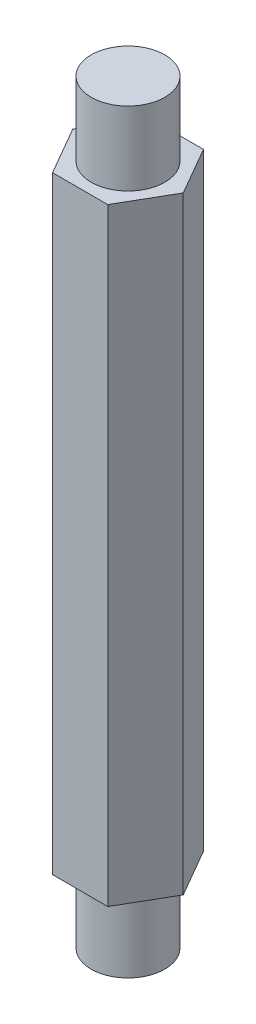
ISO-10303-21;
HEADER;
FILE_DESCRIPTION(('STEP AP214'),'2;1');
FILE_NAME('part.step','',(''),(''),'','','');
FILE_SCHEMA(('AUTOMOTIVE_DESIGN { 1 0 10303 214 1 1 1 1 }'));
ENDSEC;
DATA;
#1=APPLICATION_CONTEXT('core data for automotive mechanical design processes');
#2=APPLICATION_PROTOCOL_DEFINITION('international standard','automotive_design',2000,#1);
#3=PRODUCT_CONTEXT('',#1,'mechanical');
#4=PRODUCT('Part','Part','',(#3));
#5=PRODUCT_RELATED_PRODUCT_CATEGORY('part','',(#4));
#6=PRODUCT_DEFINITION_FORMATION('','',#4);
#7=PRODUCT_DEFINITION_CONTEXT('part definition',#1,'design');
#8=PRODUCT_DEFINITION('design','',#6,#7);
#9=PRODUCT_DEFINITION_SHAPE('','',#8);
#10=(LENGTH_UNIT() NAMED_UNIT(*) SI_UNIT(.MILLI.,.METRE.));
#11=(NAMED_UNIT(*) PLANE_ANGLE_UNIT() SI_UNIT($,.RADIAN.));
#12=(NAMED_UNIT(*) SI_UNIT($,.STERADIAN.) SOLID_ANGLE_UNIT());
#13=UNCERTAINTY_MEASURE_WITH_UNIT(LENGTH_MEASURE(1.E-05),#10,'distance_accuracy_value','');
#14=(GEOMETRIC_REPRESENTATION_CONTEXT(3) GLOBAL_UNCERTAINTY_ASSIGNED_CONTEXT((#13)) GLOBAL_UNIT_ASSIGNED_CONTEXT((#10,
#11,#12)) REPRESENTATION_CONTEXT('',''));
#15=CARTESIAN_POINT('',(0.,0.,0.));
#16=DIRECTION('',(0.,0.,1.));
#17=DIRECTION('',(1.,0.,0.));
#18=AXIS2_PLACEMENT_3D('',#15,#16,#17);
#19=CARTESIAN_POINT('',(0.,2.,0.));
#20=DIRECTION('',(0.,-1.,0.));
#21=DIRECTION('',(0.,0.,-1.));
#22=AXIS2_PLACEMENT_3D('',#19,#20,#21);
#23=CYLINDRICAL_SURFACE('',#22,1.);
#24=CARTESIAN_POINT('',(0.,2.,0.));
#25=DIRECTION('',(0.,1.,0.));
#26=DIRECTION('',(0.,0.,1.));
#27=AXIS2_PLACEMENT_3D('',#24,#25,#26);
#28=CIRCLE('',#27,1.);
#29=CARTESIAN_POINT('',(0.,2.,1.));
#30=VERTEX_POINT('',#29);
#31=EDGE_CURVE('E11',#30,#30,#28,.T.);
#32=ORIENTED_EDGE('',*,*,#31,.F.);
#33=EDGE_LOOP('',(#32));
#34=FACE_BOUND('',#33,.T.);
#35=CARTESIAN_POINT('',(0.,0.,0.));
#36=DIRECTION('',(0.,1.,0.));
#37=DIRECTION('',(0.,0.,1.));
#38=AXIS2_PLACEMENT_3D('',#35,#36,#37);
#39=CIRCLE('',#38,1.);
#40=CARTESIAN_POINT('',(0.,0.,1.));
#41=VERTEX_POINT('',#40);
#42=EDGE_CURVE('E37',#41,#41,#39,.T.);
#43=ORIENTED_EDGE('',*,*,#42,.T.);
#44=EDGE_LOOP('',(#43));
#45=FACE_BOUND('',#44,.T.);
#46=ADVANCED_FACE('F34',(#34,#45),#23,.T.);
#47=CARTESIAN_POINT('',(0.,0.,0.));
#48=DIRECTION('',(0.,1.,0.));
#49=DIRECTION('',(0.,0.,1.));
#50=AXIS2_PLACEMENT_3D('',#47,#48,#49);
#51=PLANE('',#50);
#52=ORIENTED_EDGE('',*,*,#42,.F.);
#53=EDGE_LOOP('',(#52));
#54=FACE_BOUND('',#53,.T.);
#55=ADVANCED_FACE('F143',(#54),#51,.F.);
#56=CARTESIAN_POINT('',(0.750555349946514,18.52,1.3));
#57=DIRECTION('',(-0.866025403784439,0.,-0.5));
#58=DIRECTION('',(-0.5,0.,0.866025403784439));
#59=AXIS2_PLACEMENT_3D('',#56,#57,#58);
#60=PLANE('',#59);
#61=DIRECTION('',(0.5,0.,-0.866025403784439));
#62=VECTOR('',#61,1.);
#63=CARTESIAN_POINT('',(0.750555349946514,2.,1.3));
#64=LINE('',#63,#62);
#65=CARTESIAN_POINT('',(0.750555349946514,2.,1.3));
#66=VERTEX_POINT('',#65);
#67=CARTESIAN_POINT('',(1.50111069989303,2.,0.));
#68=VERTEX_POINT('',#67);
#69=EDGE_CURVE('E119',#66,#68,#64,.T.);
#70=ORIENTED_EDGE('',*,*,#69,.T.);
#71=DIRECTION('',(0.,-1.,0.));
#72=VECTOR('',#71,1.);
#73=CARTESIAN_POINT('',(1.50111069989303,18.52,0.));
#74=LINE('',#73,#72);
#75=CARTESIAN_POINT('',(1.50111069989303,18.52,0.));
#76=VERTEX_POINT('',#75);
#77=EDGE_CURVE('E137',#76,#68,#74,.T.);
#78=ORIENTED_EDGE('',*,*,#77,.F.);
#79=DIRECTION('',(0.5,0.,-0.866025403784439));
#80=VECTOR('',#79,1.);
#81=CARTESIAN_POINT('',(0.750555349946514,18.52,1.3));
#82=LINE('',#81,#80);
#83=CARTESIAN_POINT('',(0.750555349946514,18.52,1.3));
#84=VERTEX_POINT('',#83);
#85=EDGE_CURVE('E130',#84,#76,#82,.T.);
#86=ORIENTED_EDGE('',*,*,#85,.F.);
#87=DIRECTION('',(0.,-1.,0.));
#88=VECTOR('',#87,1.);
#89=CARTESIAN_POINT('',(0.750555349946514,18.52,1.3));
#90=LINE('',#89,#88);
#91=EDGE_CURVE('E115',#84,#66,#90,.T.);
#92=ORIENTED_EDGE('',*,*,#91,.T.);
#93=EDGE_LOOP('',(#70,#78,#86,#92));
#94=FACE_BOUND('',#93,.T.);
#95=ADVANCED_FACE('F145',(#94),#60,.F.);
#96=CARTESIAN_POINT('',(1.50111069989303,18.52,0.));
#97=DIRECTION('',(-0.866025403784439,0.,0.5));
#98=DIRECTION('',(0.5,0.,0.866025403784439));
#99=AXIS2_PLACEMENT_3D('',#96,#97,#98);
#100=PLANE('',#99);
#101=DIRECTION('',(-0.5,0.,-0.866025403784439));
#102=VECTOR('',#101,1.);
#103=CARTESIAN_POINT('',(1.50111069989303,2.,0.));
#104=LINE('',#103,#102);
#105=CARTESIAN_POINT('',(0.750555349946513,2.,-1.3));
#106=VERTEX_POINT('',#105);
#107=EDGE_CURVE('E122',#68,#106,#104,.T.);
#108=ORIENTED_EDGE('',*,*,#107,.T.);
#109=DIRECTION('',(0.,-1.,0.));
#110=VECTOR('',#109,1.);
#111=CARTESIAN_POINT('',(0.750555349946513,18.52,-1.3));
#112=LINE('',#111,#110);
#113=CARTESIAN_POINT('',(0.750555349946513,18.52,-1.3));
#114=VERTEX_POINT('',#113);
#115=EDGE_CURVE('E134',#114,#106,#112,.T.);
#116=ORIENTED_EDGE('',*,*,#115,.F.);
#117=DIRECTION('',(-0.5,0.,-0.866025403784439));
#118=VECTOR('',#117,1.);
#119=CARTESIAN_POINT('',(1.50111069989303,18.52,0.));
#120=LINE('',#119,#118);
#121=EDGE_CURVE('E88',#76,#114,#120,.T.);
#122=ORIENTED_EDGE('',*,*,#121,.F.);
#123=ORIENTED_EDGE('',*,*,#77,.T.);
#124=EDGE_LOOP('',(#108,#116,#122,#123));
#125=FACE_BOUND('',#124,.T.);
#126=ADVANCED_FACE('F150',(#125),#100,.F.);
#127=CARTESIAN_POINT('',(0.750555349946513,18.52,-1.3));
#128=DIRECTION('',(0.,0.,1.));
#129=DIRECTION('',(1.,0.,0.));
#130=AXIS2_PLACEMENT_3D('',#127,#128,#129);
#131=PLANE('',#130);
#132=DIRECTION('',(-1.,0.,0.));
#133=VECTOR('',#132,1.);
#134=CARTESIAN_POINT('',(0.750555349946513,2.,-1.3));
#135=LINE('',#134,#133);
#136=CARTESIAN_POINT('',(-0.750555349946514,2.,-1.3));
#137=VERTEX_POINT('',#136);
#138=EDGE_CURVE('E125',#106,#137,#135,.T.);
#139=ORIENTED_EDGE('',*,*,#138,.T.);
#140=DIRECTION('',(0.,-1.,0.));
#141=VECTOR('',#140,1.);
#142=CARTESIAN_POINT('',(-0.750555349946514,18.52,-1.3));
#143=LINE('',#142,#141);
#144=CARTESIAN_POINT('',(-0.750555349946514,18.52,-1.3));
#145=VERTEX_POINT('',#144);
#146=EDGE_CURVE('E110',#145,#137,#143,.T.);
#147=ORIENTED_EDGE('',*,*,#146,.F.);
#148=DIRECTION('',(-1.,0.,0.));
#149=VECTOR('',#148,1.);
#150=CARTESIAN_POINT('',(0.750555349946513,18.52,-1.3));
#151=LINE('',#150,#149);
#152=EDGE_CURVE('E101',#114,#145,#151,.T.);
#153=ORIENTED_EDGE('',*,*,#152,.F.);
#154=ORIENTED_EDGE('',*,*,#115,.T.);
#155=EDGE_LOOP('',(#139,#147,#153,#154));
#156=FACE_BOUND('',#155,.T.);
#157=ADVANCED_FACE('F157',(#156),#131,.F.);
#158=CARTESIAN_POINT('',(-0.750555349946514,18.52,-1.3));
#159=DIRECTION('',(0.866025403784439,0.,0.5));
#160=DIRECTION('',(0.5,0.,-0.866025403784439));
#161=AXIS2_PLACEMENT_3D('',#158,#159,#160);
#162=PLANE('',#161);
#163=DIRECTION('',(-0.5,0.,0.866025403784439));
#164=VECTOR('',#163,1.);
#165=CARTESIAN_POINT('',(-0.750555349946514,2.,-1.3));
#166=LINE('',#165,#164);
#167=CARTESIAN_POINT('',(-1.50111069989303,2.,0.));
#168=VERTEX_POINT('',#167);
#169=EDGE_CURVE('E109',#137,#168,#166,.T.);
#170=ORIENTED_EDGE('',*,*,#169,.T.);
#171=DIRECTION('',(0.,-1.,0.));
#172=VECTOR('',#171,1.);
#173=CARTESIAN_POINT('',(-1.50111069989303,18.52,0.));
#174=LINE('',#173,#172);
#175=CARTESIAN_POINT('',(-1.50111069989303,18.52,0.));
#176=VERTEX_POINT('',#175);
#177=EDGE_CURVE('E106',#176,#168,#174,.T.);
#178=ORIENTED_EDGE('',*,*,#177,.F.);
#179=DIRECTION('',(-0.5,0.,0.866025403784439));
#180=VECTOR('',#179,1.);
#181=CARTESIAN_POINT('',(-0.750555349946514,18.52,-1.3));
#182=LINE('',#181,#180);
#183=EDGE_CURVE('E95',#145,#176,#182,.T.);
#184=ORIENTED_EDGE('',*,*,#183,.F.);
#185=ORIENTED_EDGE('',*,*,#146,.T.);
#186=EDGE_LOOP('',(#170,#178,#184,#185));
#187=FACE_BOUND('',#186,.T.);
#188=ADVANCED_FACE('F107',(#187),#162,.F.);
#189=CARTESIAN_POINT('',(-1.50111069989303,18.52,0.));
#190=DIRECTION('',(0.866025403784438,0.,-0.5));
#191=DIRECTION('',(-0.5,0.,-0.866025403784439));
#192=AXIS2_PLACEMENT_3D('',#189,#190,#191);
#193=PLANE('',#192);
#194=DIRECTION('',(0.5,0.,0.866025403784438));
#195=VECTOR('',#194,1.);
#196=CARTESIAN_POINT('',(-1.50111069989303,2.,0.));
#197=LINE('',#196,#195);
#198=CARTESIAN_POINT('',(-0.750555349946513,2.,1.3));
#199=VERTEX_POINT('',#198);
#200=EDGE_CURVE('E73',#168,#199,#197,.T.);
#201=ORIENTED_EDGE('',*,*,#200,.T.);
#202=DIRECTION('',(0.,-1.,0.));
#203=VECTOR('',#202,1.);
#204=CARTESIAN_POINT('',(-0.750555349946513,18.52,1.3));
#205=LINE('',#204,#203);
#206=CARTESIAN_POINT('',(-0.750555349946513,18.52,1.3));
#207=VERTEX_POINT('',#206);
#208=EDGE_CURVE('E111',#207,#199,#205,.T.);
#209=ORIENTED_EDGE('',*,*,#208,.F.);
#210=DIRECTION('',(0.5,0.,0.866025403784438));
#211=VECTOR('',#210,1.);
#212=CARTESIAN_POINT('',(-1.50111069989303,18.52,0.));
#213=LINE('',#212,#211);
#214=EDGE_CURVE('E99',#176,#207,#213,.T.);
#215=ORIENTED_EDGE('',*,*,#214,.F.);
#216=ORIENTED_EDGE('',*,*,#177,.T.);
#217=EDGE_LOOP('',(#201,#209,#215,#216));
#218=FACE_BOUND('',#217,.T.);
#219=ADVANCED_FACE('F113',(#218),#193,.F.);
#220=CARTESIAN_POINT('',(-0.750555349946513,18.52,1.3));
#221=DIRECTION('',(0.,0.,-1.));
#222=DIRECTION('',(-1.,0.,0.));
#223=AXIS2_PLACEMENT_3D('',#220,#221,#222);
#224=PLANE('',#223);
#225=DIRECTION('',(1.,0.,0.));
#226=VECTOR('',#225,1.);
#227=CARTESIAN_POINT('',(-0.750555349946513,2.,1.3));
#228=LINE('',#227,#226);
#229=EDGE_CURVE('E79',#199,#66,#228,.T.);
#230=ORIENTED_EDGE('',*,*,#229,.T.);
#231=ORIENTED_EDGE('',*,*,#91,.F.);
#232=DIRECTION('',(1.,0.,0.));
#233=VECTOR('',#232,1.);
#234=CARTESIAN_POINT('',(-0.750555349946513,18.52,1.3));
#235=LINE('',#234,#233);
#236=EDGE_CURVE('E50',#207,#84,#235,.T.);
#237=ORIENTED_EDGE('',*,*,#236,.F.);
#238=ORIENTED_EDGE('',*,*,#208,.T.);
#239=EDGE_LOOP('',(#230,#231,#237,#238));
#240=FACE_BOUND('',#239,.T.);
#241=ADVANCED_FACE('F165',(#240),#224,.F.);
#242=CARTESIAN_POINT('',(0.,18.52,0.));
#243=DIRECTION('',(0.,1.,0.));
#244=DIRECTION('',(0.,0.,1.));
#245=AXIS2_PLACEMENT_3D('',#242,#243,#244);
#246=PLANE('',#245);
#247=CARTESIAN_POINT('',(0.,18.52,0.));
#248=DIRECTION('',(0.,1.,0.));
#249=DIRECTION('',(0.,0.,1.));
#250=AXIS2_PLACEMENT_3D('',#247,#248,#249);
#251=CIRCLE('',#250,1.);
#252=CARTESIAN_POINT('',(0.,18.52,1.));
#253=VERTEX_POINT('',#252);
#254=EDGE_CURVE('E186',#253,#253,#251,.T.);
#255=ORIENTED_EDGE('',*,*,#254,.F.);
#256=EDGE_LOOP('',(#255));
#257=FACE_BOUND('',#256,.T.);
#258=ORIENTED_EDGE('',*,*,#85,.T.);
#259=ORIENTED_EDGE('',*,*,#121,.T.);
#260=ORIENTED_EDGE('',*,*,#152,.T.);
#261=ORIENTED_EDGE('',*,*,#183,.T.);
#262=ORIENTED_EDGE('',*,*,#214,.T.);
#263=ORIENTED_EDGE('',*,*,#236,.T.);
#264=EDGE_LOOP('',(#258,#259,#260,#261,#262,#263));
#265=FACE_BOUND('',#264,.T.);
#266=ADVANCED_FACE('F97',(#257,#265),#246,.T.);
#267=CARTESIAN_POINT('',(0.,2.,0.));
#268=DIRECTION('',(0.,1.,0.));
#269=DIRECTION('',(0.,0.,1.));
#270=AXIS2_PLACEMENT_3D('',#267,#268,#269);
#271=PLANE('',#270);
#272=ORIENTED_EDGE('',*,*,#31,.T.);
#273=EDGE_LOOP('',(#272));
#274=FACE_BOUND('',#273,.T.);
#275=ORIENTED_EDGE('',*,*,#69,.F.);
#276=ORIENTED_EDGE('',*,*,#229,.F.);
#277=ORIENTED_EDGE('',*,*,#200,.F.);
#278=ORIENTED_EDGE('',*,*,#169,.F.);
#279=ORIENTED_EDGE('',*,*,#138,.F.);
#280=ORIENTED_EDGE('',*,*,#107,.F.);
#281=EDGE_LOOP('',(#275,#276,#277,#278,#279,#280));
#282=FACE_BOUND('',#281,.T.);
#283=ADVANCED_FACE('F168',(#274,#282),#271,.F.);
#284=CARTESIAN_POINT('',(0.,20.52,0.));
#285=DIRECTION('',(0.,-1.,0.));
#286=DIRECTION('',(0.,0.,-1.));
#287=AXIS2_PLACEMENT_3D('',#284,#285,#286);
#288=CYLINDRICAL_SURFACE('',#287,1.);
#289=CARTESIAN_POINT('',(0.,20.52,0.));
#290=DIRECTION('',(0.,1.,0.));
#291=DIRECTION('',(0.,0.,1.));
#292=AXIS2_PLACEMENT_3D('',#289,#290,#291);
#293=CIRCLE('',#292,1.);
#294=CARTESIAN_POINT('',(0.,20.52,1.));
#295=VERTEX_POINT('',#294);
#296=EDGE_CURVE('E123',#295,#295,#293,.T.);
#297=ORIENTED_EDGE('',*,*,#296,.F.);
#298=EDGE_LOOP('',(#297));
#299=FACE_BOUND('',#298,.T.);
#300=ORIENTED_EDGE('',*,*,#254,.T.);
#301=EDGE_LOOP('',(#300));
#302=FACE_BOUND('',#301,.T.);
#303=ADVANCED_FACE('F171',(#299,#302),#288,.T.);
#304=CARTESIAN_POINT('',(0.,20.52,0.));
#305=DIRECTION('',(0.,1.,0.));
#306=DIRECTION('',(0.,0.,1.));
#307=AXIS2_PLACEMENT_3D('',#304,#305,#306);
#308=PLANE('',#307);
#309=ORIENTED_EDGE('',*,*,#296,.T.);
#310=EDGE_LOOP('',(#309));
#311=FACE_BOUND('',#310,.T.);
#312=ADVANCED_FACE('F178',(#311),#308,.T.);
#313=CLOSED_SHELL('',(#46,#55,#95,#126,#157,#188,#219,#241,#266,#283,#303,#312));
#314=MANIFOLD_SOLID_BREP('B2',#313);
#315=ADVANCED_BREP_SHAPE_REPRESENTATION('',(#18,#314),#14);
#316=SHAPE_DEFINITION_REPRESENTATION(#9,#315);
ENDSEC;
END-ISO-10303-21;
